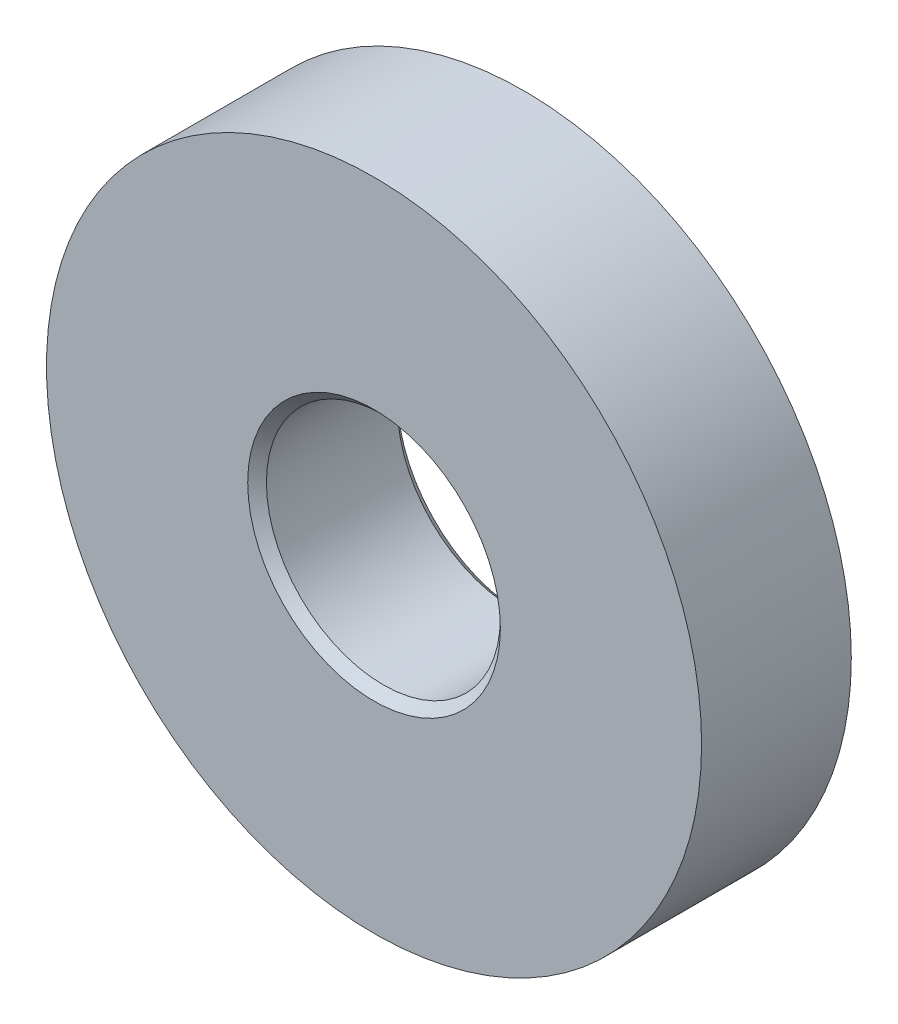
ISO-10303-21;
HEADER;
FILE_DESCRIPTION(('STEP AP214'),'2;1');
FILE_NAME('part.step','',(''),(''),'','','');
FILE_SCHEMA(('AUTOMOTIVE_DESIGN { 1 0 10303 214 1 1 1 1 }'));
ENDSEC;
DATA;
#1=APPLICATION_CONTEXT('core data for automotive mechanical design processes');
#2=APPLICATION_PROTOCOL_DEFINITION('international standard','automotive_design',2000,#1);
#3=PRODUCT_CONTEXT('',#1,'mechanical');
#4=PRODUCT('Part','Part','',(#3));
#5=PRODUCT_RELATED_PRODUCT_CATEGORY('part','',(#4));
#6=PRODUCT_DEFINITION_FORMATION('','',#4);
#7=PRODUCT_DEFINITION_CONTEXT('part definition',#1,'design');
#8=PRODUCT_DEFINITION('design','',#6,#7);
#9=PRODUCT_DEFINITION_SHAPE('','',#8);
#10=(LENGTH_UNIT() NAMED_UNIT(*) SI_UNIT(.MILLI.,.METRE.));
#11=(NAMED_UNIT(*) PLANE_ANGLE_UNIT() SI_UNIT($,.RADIAN.));
#12=(NAMED_UNIT(*) SI_UNIT($,.STERADIAN.) SOLID_ANGLE_UNIT());
#13=UNCERTAINTY_MEASURE_WITH_UNIT(LENGTH_MEASURE(1.E-05),#10,'distance_accuracy_value','');
#14=(GEOMETRIC_REPRESENTATION_CONTEXT(3) GLOBAL_UNCERTAINTY_ASSIGNED_CONTEXT((#13)) GLOBAL_UNIT_ASSIGNED_CONTEXT((#10,
#11,#12)) REPRESENTATION_CONTEXT('',''));
#15=CARTESIAN_POINT('',(0.,0.,0.));
#16=DIRECTION('',(0.,0.,1.));
#17=DIRECTION('',(1.,0.,0.));
#18=AXIS2_PLACEMENT_3D('',#15,#16,#17);
#19=CARTESIAN_POINT('',(0.,0.,-1.6));
#20=DIRECTION('',(0.,0.,1.));
#21=DIRECTION('',(1.,0.,0.));
#22=AXIS2_PLACEMENT_3D('',#19,#20,#21);
#23=CYLINDRICAL_SURFACE('',#22,3.5);
#24=CARTESIAN_POINT('',(0.,0.,-1.6));
#25=DIRECTION('',(0.,0.,1.));
#26=DIRECTION('',(1.,0.,0.));
#27=AXIS2_PLACEMENT_3D('',#24,#25,#26);
#28=CIRCLE('',#27,3.5);
#29=CARTESIAN_POINT('',(3.5,0.,-1.6));
#30=VERTEX_POINT('',#29);
#31=EDGE_CURVE('E51',#30,#30,#28,.T.);
#32=ORIENTED_EDGE('',*,*,#31,.T.);
#33=EDGE_LOOP('',(#32));
#34=FACE_BOUND('',#33,.T.);
#35=CARTESIAN_POINT('',(0.,0.,0.));
#36=DIRECTION('',(0.,0.,1.));
#37=DIRECTION('',(1.,0.,0.));
#38=AXIS2_PLACEMENT_3D('',#35,#36,#37);
#39=CIRCLE('',#38,3.5);
#40=CARTESIAN_POINT('',(3.5,0.,0.));
#41=VERTEX_POINT('',#40);
#42=EDGE_CURVE('E52',#41,#41,#39,.T.);
#43=ORIENTED_EDGE('',*,*,#42,.F.);
#44=EDGE_LOOP('',(#43));
#45=FACE_BOUND('',#44,.T.);
#46=ADVANCED_FACE('F31',(#34,#45),#23,.T.);
#47=CARTESIAN_POINT('',(0.,0.,-1.6));
#48=DIRECTION('',(0.,0.,1.));
#49=DIRECTION('',(1.,0.,0.));
#50=AXIS2_PLACEMENT_3D('',#47,#48,#49);
#51=PLANE('',#50);
#52=CARTESIAN_POINT('',(0.,0.,-1.6));
#53=DIRECTION('',(0.,0.,1.));
#54=DIRECTION('',(1.,0.,0.));
#55=AXIS2_PLACEMENT_3D('',#52,#53,#54);
#56=CIRCLE('',#55,1.35);
#57=CARTESIAN_POINT('',(1.35,0.,-1.6));
#58=VERTEX_POINT('',#57);
#59=EDGE_CURVE('E46',#58,#58,#56,.T.);
#60=ORIENTED_EDGE('',*,*,#59,.T.);
#61=EDGE_LOOP('',(#60));
#62=FACE_BOUND('',#61,.T.);
#63=ORIENTED_EDGE('',*,*,#31,.F.);
#64=EDGE_LOOP('',(#63));
#65=FACE_BOUND('',#64,.T.);
#66=ADVANCED_FACE('F60',(#62,#65),#51,.F.);
#67=CARTESIAN_POINT('',(0.,0.,0.));
#68=DIRECTION('',(0.,0.,1.));
#69=DIRECTION('',(1.,0.,0.));
#70=AXIS2_PLACEMENT_3D('',#67,#68,#69);
#71=PLANE('',#70);
#72=CARTESIAN_POINT('',(0.,0.,0.));
#73=DIRECTION('',(0.,0.,1.));
#74=DIRECTION('',(1.,0.,0.));
#75=AXIS2_PLACEMENT_3D('',#72,#73,#74);
#76=CIRCLE('',#75,1.35);
#77=CARTESIAN_POINT('',(1.35,0.,0.));
#78=VERTEX_POINT('',#77);
#79=EDGE_CURVE('E10',#78,#78,#76,.F.);
#80=ORIENTED_EDGE('',*,*,#79,.T.);
#81=EDGE_LOOP('',(#80));
#82=FACE_BOUND('',#81,.T.);
#83=ORIENTED_EDGE('',*,*,#42,.T.);
#84=EDGE_LOOP('',(#83));
#85=FACE_BOUND('',#84,.T.);
#86=ADVANCED_FACE('F62',(#82,#85),#71,.T.);
#87=CARTESIAN_POINT('',(0.,0.,-1.6));
#88=DIRECTION('',(0.,0.,1.));
#89=DIRECTION('',(1.,0.,0.));
#90=AXIS2_PLACEMENT_3D('',#87,#88,#89);
#91=CYLINDRICAL_SURFACE('',#90,1.25);
#92=CARTESIAN_POINT('',(0.,0.,-1.5));
#93=DIRECTION('',(0.,0.,1.));
#94=DIRECTION('',(1.,0.,0.));
#95=AXIS2_PLACEMENT_3D('',#92,#93,#94);
#96=CIRCLE('',#95,1.25);
#97=CARTESIAN_POINT('',(1.25,0.,-1.5));
#98=VERTEX_POINT('',#97);
#99=EDGE_CURVE('E38',#98,#98,#96,.F.);
#100=ORIENTED_EDGE('',*,*,#99,.T.);
#101=EDGE_LOOP('',(#100));
#102=FACE_BOUND('',#101,.T.);
#103=CARTESIAN_POINT('',(0.,0.,-0.0999999999999996));
#104=DIRECTION('',(0.,0.,1.));
#105=DIRECTION('',(1.,0.,0.));
#106=AXIS2_PLACEMENT_3D('',#103,#104,#105);
#107=CIRCLE('',#106,1.25);
#108=CARTESIAN_POINT('',(1.25,0.,-0.0999999999999996));
#109=VERTEX_POINT('',#108);
#110=EDGE_CURVE('E42',#109,#109,#107,.T.);
#111=ORIENTED_EDGE('',*,*,#110,.T.);
#112=EDGE_LOOP('',(#111));
#113=FACE_BOUND('',#112,.T.);
#114=ADVANCED_FACE('F69',(#102,#113),#91,.F.);
#115=CARTESIAN_POINT('',(0.,0.,-1.6));
#116=DIRECTION('',(0.,0.,-1.));
#117=DIRECTION('',(-1.,0.,0.));
#118=AXIS2_PLACEMENT_3D('',#115,#116,#117);
#119=CONICAL_SURFACE('',#118,1.35,0.785398163397447);
#120=ORIENTED_EDGE('',*,*,#99,.F.);
#121=EDGE_LOOP('',(#120));
#122=FACE_BOUND('',#121,.T.);
#123=ORIENTED_EDGE('',*,*,#59,.F.);
#124=EDGE_LOOP('',(#123));
#125=FACE_BOUND('',#124,.T.);
#126=ADVANCED_FACE('F73',(#122,#125),#119,.F.);
#127=CARTESIAN_POINT('',(0.,0.,-0.0999999999999996));
#128=DIRECTION('',(0.,0.,1.));
#129=DIRECTION('',(1.,0.,0.));
#130=AXIS2_PLACEMENT_3D('',#127,#128,#129);
#131=CONICAL_SURFACE('',#130,1.25,0.785398163397453);
#132=CARTESIAN_POINT('',(1.35,0.,0.));
#133=CARTESIAN_POINT('',(1.34895833333333,0.,-0.00104166666666662));
#134=CARTESIAN_POINT('',(1.34791666666667,0.,-0.0020833333333333));
#135=CARTESIAN_POINT('',(1.34583333333333,0.,-0.00416666666666666));
#136=CARTESIAN_POINT('',(1.34479166666667,0.,-0.00520833333333334));
#137=CARTESIAN_POINT('',(1.34270833333333,0.,-0.00729166666666668));
#138=CARTESIAN_POINT('',(1.34166666666667,0.,-0.00833333333333333));
#139=CARTESIAN_POINT('',(1.33958333333333,0.,-0.0104166666666666));
#140=CARTESIAN_POINT('',(1.33854166666667,0.,-0.0114583333333333));
#141=CARTESIAN_POINT('',(1.33645833333333,0.,-0.0135416666666666));
#142=CARTESIAN_POINT('',(1.33541666666667,0.,-0.0145833333333333));
#143=CARTESIAN_POINT('',(1.33333333333333,0.,-0.0166666666666666));
#144=CARTESIAN_POINT('',(1.33229166666667,0.,-0.0177083333333333));
#145=CARTESIAN_POINT('',(1.33020833333333,0.,-0.0197916666666666));
#146=CARTESIAN_POINT('',(1.32916666666667,0.,-0.0208333333333332));
#147=CARTESIAN_POINT('',(1.32708333333333,0.,-0.0229166666666666));
#148=CARTESIAN_POINT('',(1.32604166666667,0.,-0.0239583333333333));
#149=CARTESIAN_POINT('',(1.32395833333333,0.,-0.0260416666666666));
#150=CARTESIAN_POINT('',(1.32291666666667,0.,-0.0270833333333332));
#151=CARTESIAN_POINT('',(1.32083333333333,0.,-0.0291666666666665));
#152=CARTESIAN_POINT('',(1.31979166666667,0.,-0.0302083333333332));
#153=CARTESIAN_POINT('',(1.31770833333333,0.,-0.0322916666666665));
#154=CARTESIAN_POINT('',(1.31666666666667,0.,-0.0333333333333332));
#155=CARTESIAN_POINT('',(1.31458333333333,0.,-0.0354166666666666));
#156=CARTESIAN_POINT('',(1.31354166666667,0.,-0.0364583333333332));
#157=CARTESIAN_POINT('',(1.31145833333333,0.,-0.0385416666666665));
#158=CARTESIAN_POINT('',(1.31041666666667,0.,-0.0395833333333332));
#159=CARTESIAN_POINT('',(1.30833333333333,0.,-0.0416666666666665));
#160=CARTESIAN_POINT('',(1.30729166666667,0.,-0.0427083333333332));
#161=CARTESIAN_POINT('',(1.30520833333333,0.,-0.0447916666666665));
#162=CARTESIAN_POINT('',(1.30416666666667,0.,-0.0458333333333331));
#163=CARTESIAN_POINT('',(1.30208333333333,0.,-0.0479166666666665));
#164=CARTESIAN_POINT('',(1.30104166666667,0.,-0.0489583333333332));
#165=CARTESIAN_POINT('',(1.29895833333333,0.,-0.0510416666666665));
#166=CARTESIAN_POINT('',(1.29791666666667,0.,-0.0520833333333332));
#167=CARTESIAN_POINT('',(1.29583333333333,0.,-0.0541666666666664));
#168=CARTESIAN_POINT('',(1.29479166666667,0.,-0.0552083333333331));
#169=CARTESIAN_POINT('',(1.29270833333333,0.,-0.0572916666666664));
#170=CARTESIAN_POINT('',(1.29166666666667,0.,-0.0583333333333331));
#171=CARTESIAN_POINT('',(1.28958333333333,0.,-0.0604166666666665));
#172=CARTESIAN_POINT('',(1.28854166666667,0.,-0.0614583333333331));
#173=CARTESIAN_POINT('',(1.28645833333333,0.,-0.0635416666666664));
#174=CARTESIAN_POINT('',(1.28541666666667,0.,-0.064583333333333));
#175=CARTESIAN_POINT('',(1.28333333333333,0.,-0.0666666666666664));
#176=CARTESIAN_POINT('',(1.28229166666667,0.,-0.0677083333333331));
#177=CARTESIAN_POINT('',(1.28020833333333,0.,-0.0697916666666664));
#178=CARTESIAN_POINT('',(1.27916666666667,0.,-0.0708333333333331));
#179=CARTESIAN_POINT('',(1.27708333333333,0.,-0.0729166666666664));
#180=CARTESIAN_POINT('',(1.27604166666667,0.,-0.073958333333333));
#181=CARTESIAN_POINT('',(1.27395833333333,0.,-0.0760416666666664));
#182=CARTESIAN_POINT('',(1.27291666666667,0.,-0.077083333333333));
#183=CARTESIAN_POINT('',(1.27083333333333,0.,-0.0791666666666664));
#184=CARTESIAN_POINT('',(1.26979166666667,0.,-0.080208333333333));
#185=CARTESIAN_POINT('',(1.26770833333333,0.,-0.0822916666666663));
#186=CARTESIAN_POINT('',(1.26666666666667,0.,-0.083333333333333));
#187=CARTESIAN_POINT('',(1.26458333333333,0.,-0.0854166666666663));
#188=CARTESIAN_POINT('',(1.26354166666667,0.,-0.086458333333333));
#189=CARTESIAN_POINT('',(1.26145833333333,0.,-0.0885416666666664));
#190=CARTESIAN_POINT('',(1.26041666666667,0.,-0.089583333333333));
#191=CARTESIAN_POINT('',(1.25833333333333,0.,-0.0916666666666663));
#192=CARTESIAN_POINT('',(1.25729166666667,0.,-0.0927083333333329));
#193=CARTESIAN_POINT('',(1.25520833333333,0.,-0.0947916666666663));
#194=CARTESIAN_POINT('',(1.25416666666667,0.,-0.095833333333333));
#195=CARTESIAN_POINT('',(1.25208333333333,0.,-0.0979166666666663));
#196=CARTESIAN_POINT('',(1.25104166666667,0.,-0.098958333333333));
#197=CARTESIAN_POINT('',(1.25,0.,-0.0999999999999996));
#198=B_SPLINE_CURVE_WITH_KNOTS('',3,(#132,#133,#134,#135,#136,#137,#138,#139,#140,#141,#142,
#143,#144,#145,#146,#147,#148,#149,#150,#151,#152,#153,#154,#155,#156,#157,#158,#159,#160,#161,
#162,#163,#164,#165,#166,#167,#168,#169,#170,#171,#172,#173,#174,#175,#176,#177,#178,#179,#180,
#181,#182,#183,#184,#185,#186,#187,#188,#189,#190,#191,#192,#193,#194,#195,#196,#197),
.UNSPECIFIED.,.F.,.F.,(4,2,2,2,2,2,2,2,2,2,2,2,2,2,2,2,2,2,2,2,2,2,2,2,2,2,2,2,2,2,2,2,4),(0.,
0.00441941738241597,0.0088388347648318,0.0132582521472478,0.0176776695296638,0.0220970869120796,
0.0265165042944956,0.0309359216769115,0.0353553390593274,0.0397747564417433,0.0441941738241593,
0.0486135912065751,0.0530330085889911,0.0574524259714071,0.0618718433538229,0.0662912607362389,
0.0707106781186547,0.0751300955010707,0.0795495128834867,0.0839689302659025,0.0883883476483184,
0.0928077650307344,0.0972271824131503,0.101646599795566,0.106066017177982,0.110485434560398,
0.114904851942814,0.11932426932523,0.123743686707646,0.128163104090062,0.132582521472478,
0.137001938854894,0.14142135623731),.UNSPECIFIED.);
#199=EDGE_CURVE('BSEAM33',#78,#109,#198,.T.);
#200=ORIENTED_EDGE('',*,*,#79,.F.);
#201=ORIENTED_EDGE('',*,*,#110,.F.);
#202=ORIENTED_EDGE('',*,*,#199,.T.);
#203=ORIENTED_EDGE('',*,*,#199,.F.);
#204=EDGE_LOOP('',(#200,#202,#201,#203));
#205=FACE_BOUND('',#204,.T.);
#206=ADVANCED_FACE('F33',(#205),#131,.F.);
#207=CLOSED_SHELL('',(#46,#66,#86,#114,#126,#206));
#208=MANIFOLD_SOLID_BREP('B2',#207);
#209=ADVANCED_BREP_SHAPE_REPRESENTATION('',(#18,#208),#14);
#210=SHAPE_DEFINITION_REPRESENTATION(#9,#209);
ENDSEC;
END-ISO-10303-21;
